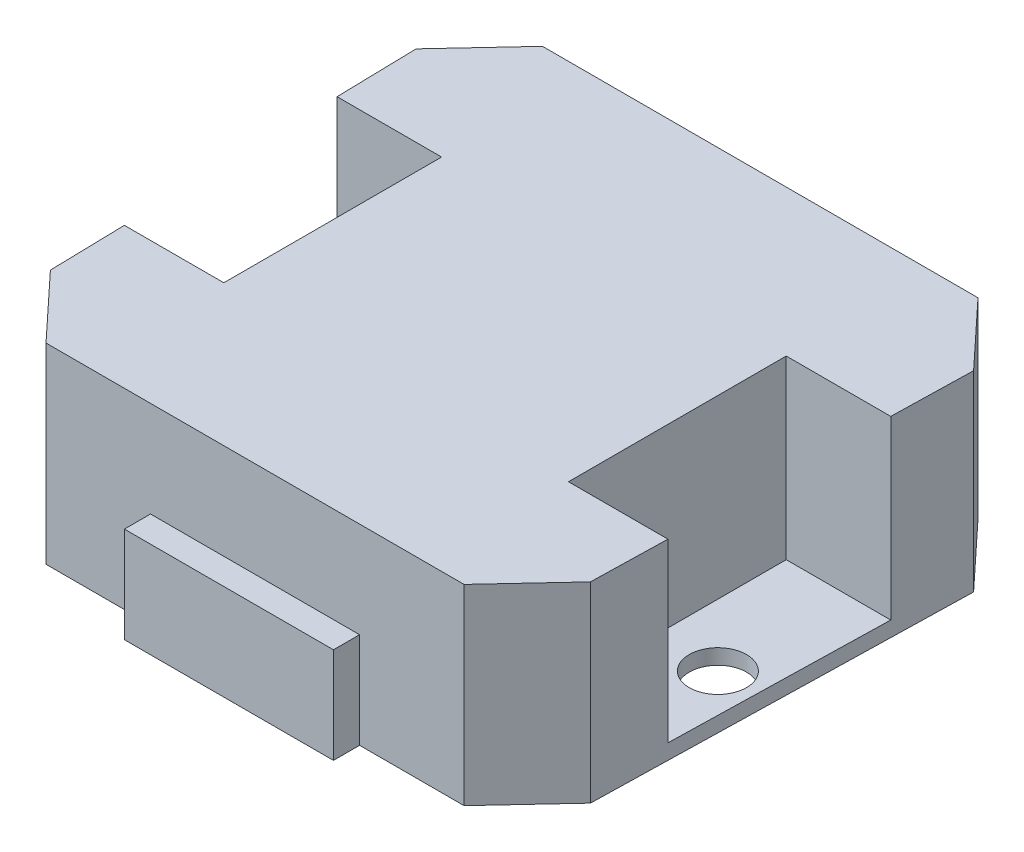
ISO-10303-21;
HEADER;
FILE_DESCRIPTION(('STEP AP214'),'2;1');
FILE_NAME('part.step','',(''),(''),'','','');
FILE_SCHEMA(('AUTOMOTIVE_DESIGN { 1 0 10303 214 1 1 1 1 }'));
ENDSEC;
DATA;
#1=APPLICATION_CONTEXT('core data for automotive mechanical design processes');
#2=APPLICATION_PROTOCOL_DEFINITION('international standard','automotive_design',2000,#1);
#3=PRODUCT_CONTEXT('',#1,'mechanical');
#4=PRODUCT('Part','Part','',(#3));
#5=PRODUCT_RELATED_PRODUCT_CATEGORY('part','',(#4));
#6=PRODUCT_DEFINITION_FORMATION('','',#4);
#7=PRODUCT_DEFINITION_CONTEXT('part definition',#1,'design');
#8=PRODUCT_DEFINITION('design','',#6,#7);
#9=PRODUCT_DEFINITION_SHAPE('','',#8);
#10=(LENGTH_UNIT() NAMED_UNIT(*) SI_UNIT(.MILLI.,.METRE.));
#11=(NAMED_UNIT(*) PLANE_ANGLE_UNIT() SI_UNIT($,.RADIAN.));
#12=(NAMED_UNIT(*) SI_UNIT($,.STERADIAN.) SOLID_ANGLE_UNIT());
#13=UNCERTAINTY_MEASURE_WITH_UNIT(LENGTH_MEASURE(1.E-05),#10,'distance_accuracy_value','');
#14=(GEOMETRIC_REPRESENTATION_CONTEXT(3) GLOBAL_UNCERTAINTY_ASSIGNED_CONTEXT((#13)) GLOBAL_UNIT_ASSIGNED_CONTEXT((#10,
#11,#12)) REPRESENTATION_CONTEXT('',''));
#15=CARTESIAN_POINT('',(0.,0.,0.));
#16=DIRECTION('',(0.,0.,1.));
#17=DIRECTION('',(1.,0.,0.));
#18=AXIS2_PLACEMENT_3D('',#15,#16,#17);
#19=CARTESIAN_POINT('',(24.,22.,29.));
#20=DIRECTION('',(0.,0.,-1.));
#21=DIRECTION('',(-1.,0.,0.));
#22=AXIS2_PLACEMENT_3D('',#19,#20,#21);
#23=PLANE('',#22);
#24=DIRECTION('',(0.,-1.,0.));
#25=VECTOR('',#24,1.);
#26=CARTESIAN_POINT('',(-12.,0.,29.));
#27=LINE('',#26,#25);
#28=CARTESIAN_POINT('',(-12.,11.,29.));
#29=VERTEX_POINT('',#28);
#30=CARTESIAN_POINT('',(-12.,0.,29.));
#31=VERTEX_POINT('',#30);
#32=EDGE_CURVE('E233',#29,#31,#27,.T.);
#33=ORIENTED_EDGE('',*,*,#32,.F.);
#34=DIRECTION('',(-1.,0.,0.));
#35=VECTOR('',#34,1.);
#36=CARTESIAN_POINT('',(-12.,11.,29.));
#37=LINE('',#36,#35);
#38=CARTESIAN_POINT('',(12.,11.,29.));
#39=VERTEX_POINT('',#38);
#40=EDGE_CURVE('E238',#39,#29,#37,.T.);
#41=ORIENTED_EDGE('',*,*,#40,.F.);
#42=DIRECTION('',(0.,1.,0.));
#43=VECTOR('',#42,1.);
#44=CARTESIAN_POINT('',(12.,0.,29.));
#45=LINE('',#44,#43);
#46=CARTESIAN_POINT('',(12.,0.,29.));
#47=VERTEX_POINT('',#46);
#48=EDGE_CURVE('E247',#47,#39,#45,.T.);
#49=ORIENTED_EDGE('',*,*,#48,.F.);
#50=DIRECTION('',(1.,0.,0.));
#51=VECTOR('',#50,1.);
#52=CARTESIAN_POINT('',(24.,0.,29.));
#53=LINE('',#52,#51);
#54=CARTESIAN_POINT('',(24.,0.,29.));
#55=VERTEX_POINT('',#54);
#56=EDGE_CURVE('E306',#47,#55,#53,.T.);
#57=ORIENTED_EDGE('',*,*,#56,.T.);
#58=DIRECTION('',(0.,-1.,0.));
#59=VECTOR('',#58,1.);
#60=CARTESIAN_POINT('',(24.,22.,29.));
#61=LINE('',#60,#59);
#62=CARTESIAN_POINT('',(24.,22.,29.));
#63=VERTEX_POINT('',#62);
#64=EDGE_CURVE('E291',#63,#55,#61,.T.);
#65=ORIENTED_EDGE('',*,*,#64,.F.);
#66=DIRECTION('',(1.,0.,0.));
#67=VECTOR('',#66,1.);
#68=CARTESIAN_POINT('',(24.,22.,29.));
#69=LINE('',#68,#67);
#70=CARTESIAN_POINT('',(-24.,22.,29.));
#71=VERTEX_POINT('',#70);
#72=EDGE_CURVE('E289',#71,#63,#69,.T.);
#73=ORIENTED_EDGE('',*,*,#72,.F.);
#74=DIRECTION('',(0.,-1.,0.));
#75=VECTOR('',#74,1.);
#76=CARTESIAN_POINT('',(-24.,22.,29.));
#77=LINE('',#76,#75);
#78=CARTESIAN_POINT('',(-24.,0.,29.));
#79=VERTEX_POINT('',#78);
#80=EDGE_CURVE('E310',#71,#79,#77,.T.);
#81=ORIENTED_EDGE('',*,*,#80,.T.);
#82=EDGE_CURVE('E274',#79,#31,#53,.T.);
#83=ORIENTED_EDGE('',*,*,#82,.T.);
#84=EDGE_LOOP('',(#33,#41,#49,#57,#65,#73,#81,#83));
#85=FACE_BOUND('',#84,.T.);
#86=ADVANCED_FACE('F34',(#85),#23,.F.);
#87=CARTESIAN_POINT('',(0.,22.,0.));
#88=DIRECTION('',(0.,-1.,0.));
#89=DIRECTION('',(0.,0.,-1.));
#90=AXIS2_PLACEMENT_3D('',#87,#88,#89);
#91=PLANE('',#90);
#92=DIRECTION('',(0.0232558139534884,0.,-0.999729546986264));
#93=VECTOR('',#92,1.);
#94=CARTESIAN_POINT('',(32.,22.,-21.4941852602047));
#95=LINE('',#94,#93);
#96=CARTESIAN_POINT('',(31.,22.,21.4941852602046));
#97=VERTEX_POINT('',#96);
#98=CARTESIAN_POINT('',(31.2022450526725,22.,12.8));
#99=VERTEX_POINT('',#98);
#100=EDGE_CURVE('E275',#97,#99,#95,.T.);
#101=ORIENTED_EDGE('',*,*,#100,.T.);
#102=DIRECTION('',(1.,0.,0.));
#103=VECTOR('',#102,1.);
#104=CARTESIAN_POINT('',(19.7837976841715,22.,12.8000000000003));
#105=LINE('',#104,#103);
#106=CARTESIAN_POINT('',(19.7837976841715,22.,12.8000000000003));
#107=VERTEX_POINT('',#106);
#108=EDGE_CURVE('E189',#107,#99,#105,.T.);
#109=ORIENTED_EDGE('',*,*,#108,.F.);
#110=DIRECTION('',(0.,0.,1.));
#111=VECTOR('',#110,1.);
#112=CARTESIAN_POINT('',(19.7837976841715,22.,-12.2));
#113=LINE('',#112,#111);
#114=CARTESIAN_POINT('',(19.7837976841715,22.,-12.2));
#115=VERTEX_POINT('',#114);
#116=EDGE_CURVE('E176',#115,#107,#113,.T.);
#117=ORIENTED_EDGE('',*,*,#116,.F.);
#118=DIRECTION('',(-1.,0.,0.));
#119=VECTOR('',#118,1.);
#120=CARTESIAN_POINT('',(19.7837976841715,22.,-12.2));
#121=LINE('',#120,#119);
#122=CARTESIAN_POINT('',(31.7837976841715,22.,-12.2));
#123=VERTEX_POINT('',#122);
#124=EDGE_CURVE('E182',#123,#115,#121,.T.);
#125=ORIENTED_EDGE('',*,*,#124,.F.);
#126=CARTESIAN_POINT('',(32.,22.,-21.4941852602047));
#127=VERTEX_POINT('',#126);
#128=EDGE_CURVE('E273',#123,#127,#95,.T.);
#129=ORIENTED_EDGE('',*,*,#128,.T.);
#130=DIRECTION('',(-0.682035596562351,0.,-0.731318976248968));
#131=VECTOR('',#130,1.);
#132=CARTESIAN_POINT('',(25.,22.,-29.));
#133=LINE('',#132,#131);
#134=CARTESIAN_POINT('',(25.,22.,-29.));
#135=VERTEX_POINT('',#134);
#136=EDGE_CURVE('E277',#127,#135,#133,.T.);
#137=ORIENTED_EDGE('',*,*,#136,.T.);
#138=DIRECTION('',(-1.,0.,0.));
#139=VECTOR('',#138,1.);
#140=CARTESIAN_POINT('',(-25.,22.,-29.));
#141=LINE('',#140,#139);
#142=CARTESIAN_POINT('',(-25.,22.,-29.));
#143=VERTEX_POINT('',#142);
#144=EDGE_CURVE('E279',#135,#143,#141,.T.);
#145=ORIENTED_EDGE('',*,*,#144,.T.);
#146=DIRECTION('',(-0.682035596562351,0.,0.731318976248968));
#147=VECTOR('',#146,1.);
#148=CARTESIAN_POINT('',(-32.,22.,-21.4941852602047));
#149=LINE('',#148,#147);
#150=CARTESIAN_POINT('',(-32.,22.,-21.4941852602047));
#151=VERTEX_POINT('',#150);
#152=EDGE_CURVE('E281',#143,#151,#149,.T.);
#153=ORIENTED_EDGE('',*,*,#152,.T.);
#154=DIRECTION('',(0.0232558139534884,0.,0.999729546986264));
#155=VECTOR('',#154,1.);
#156=CARTESIAN_POINT('',(-31.,22.,21.4941852602046));
#157=LINE('',#156,#155);
#158=CARTESIAN_POINT('',(-31.7837976841715,22.,-12.2));
#159=VERTEX_POINT('',#158);
#160=EDGE_CURVE('E284',#151,#159,#157,.T.);
#161=ORIENTED_EDGE('',*,*,#160,.T.);
#162=DIRECTION('',(-1.,0.,0.));
#163=VECTOR('',#162,1.);
#164=CARTESIAN_POINT('',(-19.7837976841715,22.,-12.2));
#165=LINE('',#164,#163);
#166=CARTESIAN_POINT('',(-19.7837976841715,22.,-12.2));
#167=VERTEX_POINT('',#166);
#168=EDGE_CURVE('E211',#167,#159,#165,.T.);
#169=ORIENTED_EDGE('',*,*,#168,.F.);
#170=DIRECTION('',(0.,0.,-1.));
#171=VECTOR('',#170,1.);
#172=CARTESIAN_POINT('',(-19.7837976841715,22.,-12.2));
#173=LINE('',#172,#171);
#174=CARTESIAN_POINT('',(-19.7837976841715,22.,12.8));
#175=VERTEX_POINT('',#174);
#176=EDGE_CURVE('E207',#175,#167,#173,.T.);
#177=ORIENTED_EDGE('',*,*,#176,.F.);
#178=DIRECTION('',(1.,0.,0.));
#179=VECTOR('',#178,1.);
#180=CARTESIAN_POINT('',(-19.7837976841715,22.,12.8));
#181=LINE('',#180,#179);
#182=CARTESIAN_POINT('',(-31.2022450526725,22.,12.8));
#183=VERTEX_POINT('',#182);
#184=EDGE_CURVE('E208',#183,#175,#181,.T.);
#185=ORIENTED_EDGE('',*,*,#184,.F.);
#186=CARTESIAN_POINT('',(-31.,22.,21.4941852602046));
#187=VERTEX_POINT('',#186);
#188=EDGE_CURVE('E283',#183,#187,#157,.T.);
#189=ORIENTED_EDGE('',*,*,#188,.T.);
#190=DIRECTION('',(0.682035596562348,0.,0.73131897624897));
#191=VECTOR('',#190,1.);
#192=CARTESIAN_POINT('',(-24.,22.,29.));
#193=LINE('',#192,#191);
#194=EDGE_CURVE('E287',#187,#71,#193,.T.);
#195=ORIENTED_EDGE('',*,*,#194,.T.);
#196=ORIENTED_EDGE('',*,*,#72,.T.);
#197=DIRECTION('',(0.682035596562348,0.,-0.73131897624897));
#198=VECTOR('',#197,1.);
#199=CARTESIAN_POINT('',(31.,22.,21.4941852602046));
#200=LINE('',#199,#198);
#201=EDGE_CURVE('E270',#63,#97,#200,.T.);
#202=ORIENTED_EDGE('',*,*,#201,.T.);
#203=EDGE_LOOP('',(#101,#109,#117,#125,#129,#137,#145,#153,#161,#169,#177,#185,#189,#195,#196,#202));
#204=FACE_BOUND('',#203,.T.);
#205=ADVANCED_FACE('F192',(#204),#91,.F.);
#206=CARTESIAN_POINT('',(0.,0.,0.));
#207=DIRECTION('',(0.,-1.,0.));
#208=DIRECTION('',(0.,0.,-1.));
#209=AXIS2_PLACEMENT_3D('',#206,#207,#208);
#210=PLANE('',#209);
#211=CARTESIAN_POINT('',(-26.9336487374695,0.,2.8));
#212=DIRECTION('',(0.,1.,0.));
#213=DIRECTION('',(0.,0.,1.));
#214=AXIS2_PLACEMENT_3D('',#211,#212,#213);
#215=CIRCLE('',#214,3.29);
#216=CARTESIAN_POINT('',(-26.9336487374695,0.,6.09000000000001));
#217=VERTEX_POINT('',#216);
#218=EDGE_CURVE('E266',#217,#217,#215,.T.);
#219=ORIENTED_EDGE('',*,*,#218,.T.);
#220=EDGE_LOOP('',(#219));
#221=FACE_BOUND('',#220,.T.);
#222=DIRECTION('',(0.682035596562348,0.,-0.73131897624897));
#223=VECTOR('',#222,1.);
#224=CARTESIAN_POINT('',(31.,0.,21.4941852602046));
#225=LINE('',#224,#223);
#226=CARTESIAN_POINT('',(31.,0.,21.4941852602046));
#227=VERTEX_POINT('',#226);
#228=EDGE_CURVE('E269',#55,#227,#225,.T.);
#229=ORIENTED_EDGE('',*,*,#228,.F.);
#230=ORIENTED_EDGE('',*,*,#56,.F.);
#231=DIRECTION('',(0.,0.,-1.));
#232=VECTOR('',#231,1.);
#233=CARTESIAN_POINT('',(12.,0.,32.));
#234=LINE('',#233,#232);
#235=CARTESIAN_POINT('',(12.,0.,32.));
#236=VERTEX_POINT('',#235);
#237=EDGE_CURVE('E257',#236,#47,#234,.T.);
#238=ORIENTED_EDGE('',*,*,#237,.F.);
#239=DIRECTION('',(1.,0.,0.));
#240=VECTOR('',#239,1.);
#241=CARTESIAN_POINT('',(-12.,0.,32.));
#242=LINE('',#241,#240);
#243=CARTESIAN_POINT('',(-12.,0.,32.));
#244=VERTEX_POINT('',#243);
#245=EDGE_CURVE('E237',#244,#236,#242,.T.);
#246=ORIENTED_EDGE('',*,*,#245,.F.);
#247=DIRECTION('',(0.,0.,-1.));
#248=VECTOR('',#247,1.);
#249=CARTESIAN_POINT('',(-12.,0.,32.));
#250=LINE('',#249,#248);
#251=EDGE_CURVE('E260',#244,#31,#250,.T.);
#252=ORIENTED_EDGE('',*,*,#251,.T.);
#253=ORIENTED_EDGE('',*,*,#82,.F.);
#254=DIRECTION('',(0.682035596562348,0.,0.73131897624897));
#255=VECTOR('',#254,1.);
#256=CARTESIAN_POINT('',(-24.,0.,29.));
#257=LINE('',#256,#255);
#258=CARTESIAN_POINT('',(-31.,0.,21.4941852602046));
#259=VERTEX_POINT('',#258);
#260=EDGE_CURVE('E304',#259,#79,#257,.T.);
#261=ORIENTED_EDGE('',*,*,#260,.F.);
#262=DIRECTION('',(0.0232558139534884,0.,0.999729546986264));
#263=VECTOR('',#262,1.);
#264=CARTESIAN_POINT('',(-31.,0.,21.4941852602046));
#265=LINE('',#264,#263);
#266=CARTESIAN_POINT('',(-32.,0.,-21.4941852602047));
#267=VERTEX_POINT('',#266);
#268=EDGE_CURVE('E302',#267,#259,#265,.T.);
#269=ORIENTED_EDGE('',*,*,#268,.F.);
#270=DIRECTION('',(-0.682035596562351,0.,0.731318976248968));
#271=VECTOR('',#270,1.);
#272=CARTESIAN_POINT('',(-32.,0.,-21.4941852602047));
#273=LINE('',#272,#271);
#274=CARTESIAN_POINT('',(-25.,0.,-29.));
#275=VERTEX_POINT('',#274);
#276=EDGE_CURVE('E300',#275,#267,#273,.T.);
#277=ORIENTED_EDGE('',*,*,#276,.F.);
#278=DIRECTION('',(-1.,0.,0.));
#279=VECTOR('',#278,1.);
#280=CARTESIAN_POINT('',(-25.,0.,-29.));
#281=LINE('',#280,#279);
#282=CARTESIAN_POINT('',(25.,0.,-29.));
#283=VERTEX_POINT('',#282);
#284=EDGE_CURVE('E298',#283,#275,#281,.T.);
#285=ORIENTED_EDGE('',*,*,#284,.F.);
#286=DIRECTION('',(-0.682035596562351,0.,-0.731318976248968));
#287=VECTOR('',#286,1.);
#288=CARTESIAN_POINT('',(25.,0.,-29.));
#289=LINE('',#288,#287);
#290=CARTESIAN_POINT('',(32.,0.,-21.4941852602047));
#291=VERTEX_POINT('',#290);
#292=EDGE_CURVE('E296',#291,#283,#289,.T.);
#293=ORIENTED_EDGE('',*,*,#292,.F.);
#294=DIRECTION('',(0.0232558139534884,0.,-0.999729546986264));
#295=VECTOR('',#294,1.);
#296=CARTESIAN_POINT('',(32.,0.,-21.4941852602047));
#297=LINE('',#296,#295);
#298=EDGE_CURVE('E294',#227,#291,#297,.T.);
#299=ORIENTED_EDGE('',*,*,#298,.F.);
#300=EDGE_LOOP('',(#229,#230,#238,#246,#252,#253,#261,#269,#277,#285,#293,#299));
#301=FACE_BOUND('',#300,.T.);
#302=CARTESIAN_POINT('',(26.9336487374695,0.,2.8));
#303=DIRECTION('',(0.,1.,0.));
#304=DIRECTION('',(0.,0.,1.));
#305=AXIS2_PLACEMENT_3D('',#302,#303,#304);
#306=CIRCLE('',#305,3.29);
#307=CARTESIAN_POINT('',(26.9336487374695,0.,6.09));
#308=VERTEX_POINT('',#307);
#309=EDGE_CURVE('E263',#308,#308,#306,.T.);
#310=ORIENTED_EDGE('',*,*,#309,.T.);
#311=EDGE_LOOP('',(#310));
#312=FACE_BOUND('',#311,.T.);
#313=ADVANCED_FACE('F348',(#221,#301,#312),#210,.T.);
#314=CARTESIAN_POINT('',(31.,22.,21.4941852602046));
#315=DIRECTION('',(-0.73131897624897,0.,-0.682035596562348));
#316=DIRECTION('',(-0.682035596562348,0.,0.73131897624897));
#317=AXIS2_PLACEMENT_3D('',#314,#315,#316);
#318=PLANE('',#317);
#319=ORIENTED_EDGE('',*,*,#228,.T.);
#320=DIRECTION('',(0.,-1.,0.));
#321=VECTOR('',#320,1.);
#322=CARTESIAN_POINT('',(31.,22.,21.4941852602046));
#323=LINE('',#322,#321);
#324=EDGE_CURVE('E328',#97,#227,#323,.T.);
#325=ORIENTED_EDGE('',*,*,#324,.F.);
#326=ORIENTED_EDGE('',*,*,#201,.F.);
#327=ORIENTED_EDGE('',*,*,#64,.T.);
#328=EDGE_LOOP('',(#319,#325,#326,#327));
#329=FACE_BOUND('',#328,.T.);
#330=ADVANCED_FACE('F36',(#329),#318,.F.);
#331=CARTESIAN_POINT('',(32.,22.,-21.4941852602047));
#332=DIRECTION('',(-0.999729546986264,0.,-0.0232558139534884));
#333=DIRECTION('',(-0.0232558139534884,0.,0.999729546986264));
#334=AXIS2_PLACEMENT_3D('',#331,#332,#333);
#335=PLANE('',#334);
#336=DIRECTION('',(-0.0232558139534884,0.,0.999729546986264));
#337=VECTOR('',#336,1.);
#338=CARTESIAN_POINT('',(32.,1.75,-21.4941852602047));
#339=LINE('',#338,#337);
#340=CARTESIAN_POINT('',(31.7837976841715,1.74999999999999,-12.2));
#341=VERTEX_POINT('',#340);
#342=CARTESIAN_POINT('',(31.2022450526725,1.75,12.8));
#343=VERTEX_POINT('',#342);
#344=EDGE_CURVE('E204',#341,#343,#339,.T.);
#345=ORIENTED_EDGE('',*,*,#344,.T.);
#346=DIRECTION('',(0.,1.,0.));
#347=VECTOR('',#346,1.);
#348=CARTESIAN_POINT('',(31.2022450526725,22.,12.8));
#349=LINE('',#348,#347);
#350=EDGE_CURVE('E12',#343,#99,#349,.T.);
#351=ORIENTED_EDGE('',*,*,#350,.T.);
#352=ORIENTED_EDGE('',*,*,#100,.F.);
#353=ORIENTED_EDGE('',*,*,#324,.T.);
#354=ORIENTED_EDGE('',*,*,#298,.T.);
#355=DIRECTION('',(0.,-1.,0.));
#356=VECTOR('',#355,1.);
#357=CARTESIAN_POINT('',(32.,22.,-21.4941852602047));
#358=LINE('',#357,#356);
#359=EDGE_CURVE('E325',#127,#291,#358,.T.);
#360=ORIENTED_EDGE('',*,*,#359,.F.);
#361=ORIENTED_EDGE('',*,*,#128,.F.);
#362=DIRECTION('',(0.,1.,0.));
#363=VECTOR('',#362,1.);
#364=CARTESIAN_POINT('',(31.7837976841715,-27.7308492477243,-12.2));
#365=LINE('',#364,#363);
#366=EDGE_CURVE('E185',#341,#123,#365,.T.);
#367=ORIENTED_EDGE('',*,*,#366,.F.);
#368=EDGE_LOOP('',(#345,#351,#352,#353,#354,#360,#361,#367));
#369=FACE_BOUND('',#368,.T.);
#370=ADVANCED_FACE('F356',(#369),#335,.F.);
#371=CARTESIAN_POINT('',(25.,22.,-29.));
#372=DIRECTION('',(-0.731318976248968,0.,0.682035596562351));
#373=DIRECTION('',(0.682035596562351,0.,0.731318976248968));
#374=AXIS2_PLACEMENT_3D('',#371,#372,#373);
#375=PLANE('',#374);
#376=ORIENTED_EDGE('',*,*,#292,.T.);
#377=DIRECTION('',(0.,-1.,0.));
#378=VECTOR('',#377,1.);
#379=CARTESIAN_POINT('',(25.,22.,-29.));
#380=LINE('',#379,#378);
#381=EDGE_CURVE('E322',#135,#283,#380,.T.);
#382=ORIENTED_EDGE('',*,*,#381,.F.);
#383=ORIENTED_EDGE('',*,*,#136,.F.);
#384=ORIENTED_EDGE('',*,*,#359,.T.);
#385=EDGE_LOOP('',(#376,#382,#383,#384));
#386=FACE_BOUND('',#385,.T.);
#387=ADVANCED_FACE('F381',(#386),#375,.F.);
#388=CARTESIAN_POINT('',(-25.,22.,-29.));
#389=DIRECTION('',(0.,0.,1.));
#390=DIRECTION('',(1.,0.,0.));
#391=AXIS2_PLACEMENT_3D('',#388,#389,#390);
#392=PLANE('',#391);
#393=ORIENTED_EDGE('',*,*,#284,.T.);
#394=DIRECTION('',(0.,-1.,0.));
#395=VECTOR('',#394,1.);
#396=CARTESIAN_POINT('',(-25.,22.,-29.));
#397=LINE('',#396,#395);
#398=EDGE_CURVE('E319',#143,#275,#397,.T.);
#399=ORIENTED_EDGE('',*,*,#398,.F.);
#400=ORIENTED_EDGE('',*,*,#144,.F.);
#401=ORIENTED_EDGE('',*,*,#381,.T.);
#402=EDGE_LOOP('',(#393,#399,#400,#401));
#403=FACE_BOUND('',#402,.T.);
#404=ADVANCED_FACE('F377',(#403),#392,.F.);
#405=CARTESIAN_POINT('',(-32.,22.,-21.4941852602047));
#406=DIRECTION('',(0.731318976248968,0.,0.682035596562351));
#407=DIRECTION('',(0.682035596562351,0.,-0.731318976248968));
#408=AXIS2_PLACEMENT_3D('',#405,#406,#407);
#409=PLANE('',#408);
#410=ORIENTED_EDGE('',*,*,#276,.T.);
#411=DIRECTION('',(0.,-1.,0.));
#412=VECTOR('',#411,1.);
#413=CARTESIAN_POINT('',(-32.,22.,-21.4941852602047));
#414=LINE('',#413,#412);
#415=EDGE_CURVE('E316',#151,#267,#414,.T.);
#416=ORIENTED_EDGE('',*,*,#415,.F.);
#417=ORIENTED_EDGE('',*,*,#152,.F.);
#418=ORIENTED_EDGE('',*,*,#398,.T.);
#419=EDGE_LOOP('',(#410,#416,#417,#418));
#420=FACE_BOUND('',#419,.T.);
#421=ADVANCED_FACE('F373',(#420),#409,.F.);
#422=CARTESIAN_POINT('',(-31.,22.,21.4941852602046));
#423=DIRECTION('',(0.999729546986264,0.,-0.0232558139534884));
#424=DIRECTION('',(-0.0232558139534884,0.,-0.999729546986264));
#425=AXIS2_PLACEMENT_3D('',#422,#423,#424);
#426=PLANE('',#425);
#427=DIRECTION('',(-0.0232558139534884,0.,-0.999729546986264));
#428=VECTOR('',#427,1.);
#429=CARTESIAN_POINT('',(-31.,1.75,21.4941852602046));
#430=LINE('',#429,#428);
#431=CARTESIAN_POINT('',(-31.2022450526725,1.74999999999999,12.8));
#432=VERTEX_POINT('',#431);
#433=CARTESIAN_POINT('',(-31.7837976841715,1.74999999999999,-12.2));
#434=VERTEX_POINT('',#433);
#435=EDGE_CURVE('E230',#432,#434,#430,.T.);
#436=ORIENTED_EDGE('',*,*,#435,.T.);
#437=DIRECTION('',(0.,1.,0.));
#438=VECTOR('',#437,1.);
#439=CARTESIAN_POINT('',(-31.7837976841715,-27.7308492477243,-12.2));
#440=LINE('',#439,#438);
#441=EDGE_CURVE('E217',#434,#159,#440,.T.);
#442=ORIENTED_EDGE('',*,*,#441,.T.);
#443=ORIENTED_EDGE('',*,*,#160,.F.);
#444=ORIENTED_EDGE('',*,*,#415,.T.);
#445=ORIENTED_EDGE('',*,*,#268,.T.);
#446=DIRECTION('',(0.,-1.,0.));
#447=VECTOR('',#446,1.);
#448=CARTESIAN_POINT('',(-31.,22.,21.4941852602046));
#449=LINE('',#448,#447);
#450=EDGE_CURVE('E313',#187,#259,#449,.T.);
#451=ORIENTED_EDGE('',*,*,#450,.F.);
#452=ORIENTED_EDGE('',*,*,#188,.F.);
#453=DIRECTION('',(0.,-1.,0.));
#454=VECTOR('',#453,1.);
#455=CARTESIAN_POINT('',(-31.2022450526725,22.,12.8));
#456=LINE('',#455,#454);
#457=EDGE_CURVE('E42',#183,#432,#456,.T.);
#458=ORIENTED_EDGE('',*,*,#457,.T.);
#459=EDGE_LOOP('',(#436,#442,#443,#444,#445,#451,#452,#458));
#460=FACE_BOUND('',#459,.T.);
#461=ADVANCED_FACE('F369',(#460),#426,.F.);
#462=CARTESIAN_POINT('',(-24.,22.,29.));
#463=DIRECTION('',(0.73131897624897,0.,-0.682035596562348));
#464=DIRECTION('',(-0.682035596562348,0.,-0.73131897624897));
#465=AXIS2_PLACEMENT_3D('',#462,#463,#464);
#466=PLANE('',#465);
#467=ORIENTED_EDGE('',*,*,#260,.T.);
#468=ORIENTED_EDGE('',*,*,#80,.F.);
#469=ORIENTED_EDGE('',*,*,#194,.F.);
#470=ORIENTED_EDGE('',*,*,#450,.T.);
#471=EDGE_LOOP('',(#467,#468,#469,#470));
#472=FACE_BOUND('',#471,.T.);
#473=ADVANCED_FACE('F366',(#472),#466,.F.);
#474=CARTESIAN_POINT('',(-26.9336487374695,22.,2.8));
#475=DIRECTION('',(0.,-1.,0.));
#476=DIRECTION('',(0.,0.,-1.));
#477=AXIS2_PLACEMENT_3D('',#474,#475,#476);
#478=CYLINDRICAL_SURFACE('',#477,3.29);
#479=CARTESIAN_POINT('',(-26.9336487374695,1.75,2.8));
#480=DIRECTION('',(0.,-1.,0.));
#481=DIRECTION('',(0.,0.,-1.));
#482=AXIS2_PLACEMENT_3D('',#479,#480,#481);
#483=CIRCLE('',#482,3.29);
#484=CARTESIAN_POINT('',(-26.9336487374695,1.75,-0.489999999999997));
#485=VERTEX_POINT('',#484);
#486=EDGE_CURVE('E229',#485,#485,#483,.T.);
#487=ORIENTED_EDGE('',*,*,#486,.F.);
#488=EDGE_LOOP('',(#487));
#489=FACE_BOUND('',#488,.T.);
#490=ORIENTED_EDGE('',*,*,#218,.F.);
#491=EDGE_LOOP('',(#490));
#492=FACE_BOUND('',#491,.T.);
#493=ADVANCED_FACE('F344',(#489,#492),#478,.F.);
#494=CARTESIAN_POINT('',(26.9336487374695,22.,2.8));
#495=DIRECTION('',(0.,-1.,0.));
#496=DIRECTION('',(0.,0.,-1.));
#497=AXIS2_PLACEMENT_3D('',#494,#495,#496);
#498=CYLINDRICAL_SURFACE('',#497,3.29);
#499=CARTESIAN_POINT('',(26.9336487374695,1.75,2.8));
#500=DIRECTION('',(0.,-1.,0.));
#501=DIRECTION('',(0.,0.,-1.));
#502=AXIS2_PLACEMENT_3D('',#499,#500,#501);
#503=CIRCLE('',#502,3.29);
#504=CARTESIAN_POINT('',(26.9336487374695,1.75,-0.490000000000001));
#505=VERTEX_POINT('',#504);
#506=EDGE_CURVE('E203',#505,#505,#503,.T.);
#507=ORIENTED_EDGE('',*,*,#506,.F.);
#508=EDGE_LOOP('',(#507));
#509=FACE_BOUND('',#508,.T.);
#510=ORIENTED_EDGE('',*,*,#309,.F.);
#511=EDGE_LOOP('',(#510));
#512=FACE_BOUND('',#511,.T.);
#513=ADVANCED_FACE('F340',(#509,#512),#498,.F.);
#514=CARTESIAN_POINT('',(-12.,0.,32.));
#515=DIRECTION('',(1.,0.,0.));
#516=DIRECTION('',(0.,0.,-1.));
#517=AXIS2_PLACEMENT_3D('',#514,#515,#516);
#518=PLANE('',#517);
#519=ORIENTED_EDGE('',*,*,#32,.T.);
#520=ORIENTED_EDGE('',*,*,#251,.F.);
#521=DIRECTION('',(0.,-1.,0.));
#522=VECTOR('',#521,1.);
#523=CARTESIAN_POINT('',(-12.,0.,32.));
#524=LINE('',#523,#522);
#525=CARTESIAN_POINT('',(-12.,11.,32.));
#526=VERTEX_POINT('',#525);
#527=EDGE_CURVE('E234',#526,#244,#524,.T.);
#528=ORIENTED_EDGE('',*,*,#527,.F.);
#529=DIRECTION('',(0.,0.,-1.));
#530=VECTOR('',#529,1.);
#531=CARTESIAN_POINT('',(-12.,11.,32.));
#532=LINE('',#531,#530);
#533=EDGE_CURVE('E244',#526,#29,#532,.T.);
#534=ORIENTED_EDGE('',*,*,#533,.T.);
#535=EDGE_LOOP('',(#519,#520,#528,#534));
#536=FACE_BOUND('',#535,.T.);
#537=ADVANCED_FACE('F343',(#536),#518,.F.);
#538=CARTESIAN_POINT('',(12.,0.,32.));
#539=DIRECTION('',(-1.,0.,0.));
#540=DIRECTION('',(0.,0.,1.));
#541=AXIS2_PLACEMENT_3D('',#538,#539,#540);
#542=PLANE('',#541);
#543=ORIENTED_EDGE('',*,*,#48,.T.);
#544=DIRECTION('',(0.,0.,-1.));
#545=VECTOR('',#544,1.);
#546=CARTESIAN_POINT('',(12.,11.,32.));
#547=LINE('',#546,#545);
#548=CARTESIAN_POINT('',(12.,11.,32.));
#549=VERTEX_POINT('',#548);
#550=EDGE_CURVE('E254',#549,#39,#547,.T.);
#551=ORIENTED_EDGE('',*,*,#550,.F.);
#552=DIRECTION('',(0.,1.,0.));
#553=VECTOR('',#552,1.);
#554=CARTESIAN_POINT('',(12.,0.,32.));
#555=LINE('',#554,#553);
#556=EDGE_CURVE('E240',#236,#549,#555,.T.);
#557=ORIENTED_EDGE('',*,*,#556,.F.);
#558=ORIENTED_EDGE('',*,*,#237,.T.);
#559=EDGE_LOOP('',(#543,#551,#557,#558));
#560=FACE_BOUND('',#559,.T.);
#561=ADVANCED_FACE('F422',(#560),#542,.F.);
#562=CARTESIAN_POINT('',(-12.,11.,32.));
#563=DIRECTION('',(0.,-1.,0.));
#564=DIRECTION('',(0.,0.,-1.));
#565=AXIS2_PLACEMENT_3D('',#562,#563,#564);
#566=PLANE('',#565);
#567=ORIENTED_EDGE('',*,*,#40,.T.);
#568=ORIENTED_EDGE('',*,*,#533,.F.);
#569=DIRECTION('',(-1.,0.,0.));
#570=VECTOR('',#569,1.);
#571=CARTESIAN_POINT('',(-12.,11.,32.));
#572=LINE('',#571,#570);
#573=EDGE_CURVE('E242',#549,#526,#572,.T.);
#574=ORIENTED_EDGE('',*,*,#573,.F.);
#575=ORIENTED_EDGE('',*,*,#550,.T.);
#576=EDGE_LOOP('',(#567,#568,#574,#575));
#577=FACE_BOUND('',#576,.T.);
#578=ADVANCED_FACE('F418',(#577),#566,.F.);
#579=CARTESIAN_POINT('',(0.,0.,32.));
#580=DIRECTION('',(0.,0.,-1.));
#581=DIRECTION('',(-1.,0.,0.));
#582=AXIS2_PLACEMENT_3D('',#579,#580,#581);
#583=PLANE('',#582);
#584=ORIENTED_EDGE('',*,*,#527,.T.);
#585=ORIENTED_EDGE('',*,*,#245,.T.);
#586=ORIENTED_EDGE('',*,*,#556,.T.);
#587=ORIENTED_EDGE('',*,*,#573,.T.);
#588=EDGE_LOOP('',(#584,#585,#586,#587));
#589=FACE_BOUND('',#588,.T.);
#590=ADVANCED_FACE('F409',(#589),#583,.F.);
#591=CARTESIAN_POINT('',(-19.7837976841715,-27.7308492477243,12.8));
#592=DIRECTION('',(0.,0.,1.));
#593=DIRECTION('',(1.,0.,0.));
#594=AXIS2_PLACEMENT_3D('',#591,#592,#593);
#595=PLANE('',#594);
#596=ORIENTED_EDGE('',*,*,#184,.T.);
#597=DIRECTION('',(0.,1.,0.));
#598=VECTOR('',#597,1.);
#599=CARTESIAN_POINT('',(-19.7837976841715,-27.7308492477243,12.8));
#600=LINE('',#599,#598);
#601=CARTESIAN_POINT('',(-19.7837976841715,1.75,12.8));
#602=VERTEX_POINT('',#601);
#603=EDGE_CURVE('E222',#602,#175,#600,.T.);
#604=ORIENTED_EDGE('',*,*,#603,.F.);
#605=DIRECTION('',(1.,0.,0.));
#606=VECTOR('',#605,1.);
#607=CARTESIAN_POINT('',(-19.7837976841715,1.75,12.8));
#608=LINE('',#607,#606);
#609=EDGE_CURVE('E57',#432,#602,#608,.T.);
#610=ORIENTED_EDGE('',*,*,#609,.F.);
#611=ORIENTED_EDGE('',*,*,#457,.F.);
#612=EDGE_LOOP('',(#596,#604,#610,#611));
#613=FACE_BOUND('',#612,.T.);
#614=ADVANCED_FACE('F405',(#613),#595,.F.);
#615=CARTESIAN_POINT('',(0.,1.75,0.));
#616=DIRECTION('',(0.,-1.,0.));
#617=DIRECTION('',(0.,0.,-1.));
#618=AXIS2_PLACEMENT_3D('',#615,#616,#617);
#619=PLANE('',#618);
#620=ORIENTED_EDGE('',*,*,#486,.T.);
#621=EDGE_LOOP('',(#620));
#622=FACE_BOUND('',#621,.T.);
#623=ORIENTED_EDGE('',*,*,#609,.T.);
#624=DIRECTION('',(0.,0.,-1.));
#625=VECTOR('',#624,1.);
#626=CARTESIAN_POINT('',(-19.7837976841715,1.75,-12.2));
#627=LINE('',#626,#625);
#628=CARTESIAN_POINT('',(-19.7837976841715,1.75,-12.2));
#629=VERTEX_POINT('',#628);
#630=EDGE_CURVE('E218',#602,#629,#627,.T.);
#631=ORIENTED_EDGE('',*,*,#630,.T.);
#632=DIRECTION('',(-1.,0.,0.));
#633=VECTOR('',#632,1.);
#634=CARTESIAN_POINT('',(-19.7837976841715,1.75,-12.2));
#635=LINE('',#634,#633);
#636=EDGE_CURVE('E210',#629,#434,#635,.T.);
#637=ORIENTED_EDGE('',*,*,#636,.T.);
#638=ORIENTED_EDGE('',*,*,#435,.F.);
#639=EDGE_LOOP('',(#623,#631,#637,#638));
#640=FACE_BOUND('',#639,.T.);
#641=ADVANCED_FACE('F408',(#622,#640),#619,.F.);
#642=CARTESIAN_POINT('',(-19.7837976841715,-27.7308492477243,-12.2));
#643=DIRECTION('',(0.,0.,-1.));
#644=DIRECTION('',(-1.,0.,0.));
#645=AXIS2_PLACEMENT_3D('',#642,#643,#644);
#646=PLANE('',#645);
#647=DIRECTION('',(0.,1.,0.));
#648=VECTOR('',#647,1.);
#649=CARTESIAN_POINT('',(-19.7837976841715,-27.7308492477243,-12.2));
#650=LINE('',#649,#648);
#651=EDGE_CURVE('E221',#629,#167,#650,.T.);
#652=ORIENTED_EDGE('',*,*,#651,.T.);
#653=ORIENTED_EDGE('',*,*,#168,.T.);
#654=ORIENTED_EDGE('',*,*,#441,.F.);
#655=ORIENTED_EDGE('',*,*,#636,.F.);
#656=EDGE_LOOP('',(#652,#653,#654,#655));
#657=FACE_BOUND('',#656,.T.);
#658=ADVANCED_FACE('F399',(#657),#646,.F.);
#659=CARTESIAN_POINT('',(-19.7837976841715,-27.7308492477243,-12.2));
#660=DIRECTION('',(1.,0.,0.));
#661=DIRECTION('',(0.,0.,-1.));
#662=AXIS2_PLACEMENT_3D('',#659,#660,#661);
#663=PLANE('',#662);
#664=ORIENTED_EDGE('',*,*,#603,.T.);
#665=ORIENTED_EDGE('',*,*,#176,.T.);
#666=ORIENTED_EDGE('',*,*,#651,.F.);
#667=ORIENTED_EDGE('',*,*,#630,.F.);
#668=EDGE_LOOP('',(#664,#665,#666,#667));
#669=FACE_BOUND('',#668,.T.);
#670=ADVANCED_FACE('F392',(#669),#663,.F.);
#671=CARTESIAN_POINT('',(19.7837976841715,-27.7308492477243,12.8000000000003));
#672=DIRECTION('',(0.,0.,1.));
#673=DIRECTION('',(1.,0.,0.));
#674=AXIS2_PLACEMENT_3D('',#671,#672,#673);
#675=PLANE('',#674);
#676=DIRECTION('',(1.,0.,0.));
#677=VECTOR('',#676,1.);
#678=CARTESIAN_POINT('',(19.7837976841715,1.75,12.8000000000003));
#679=LINE('',#678,#677);
#680=CARTESIAN_POINT('',(19.7837976841715,1.75,12.8000000000003));
#681=VERTEX_POINT('',#680);
#682=EDGE_CURVE('E188',#681,#343,#679,.T.);
#683=ORIENTED_EDGE('',*,*,#682,.F.);
#684=DIRECTION('',(0.,1.,0.));
#685=VECTOR('',#684,1.);
#686=CARTESIAN_POINT('',(19.7837976841715,-27.7308492477243,12.8000000000003));
#687=LINE('',#686,#685);
#688=EDGE_CURVE('E199',#681,#107,#687,.T.);
#689=ORIENTED_EDGE('',*,*,#688,.T.);
#690=ORIENTED_EDGE('',*,*,#108,.T.);
#691=ORIENTED_EDGE('',*,*,#350,.F.);
#692=EDGE_LOOP('',(#683,#689,#690,#691));
#693=FACE_BOUND('',#692,.T.);
#694=ADVANCED_FACE('F390',(#693),#675,.F.);
#695=CARTESIAN_POINT('',(0.,1.75,0.));
#696=DIRECTION('',(0.,-1.,0.));
#697=DIRECTION('',(0.,0.,-1.));
#698=AXIS2_PLACEMENT_3D('',#695,#696,#697);
#699=PLANE('',#698);
#700=ORIENTED_EDGE('',*,*,#506,.T.);
#701=EDGE_LOOP('',(#700));
#702=FACE_BOUND('',#701,.T.);
#703=DIRECTION('',(-1.,0.,0.));
#704=VECTOR('',#703,1.);
#705=CARTESIAN_POINT('',(19.7837976841715,1.75,-12.2));
#706=LINE('',#705,#704);
#707=CARTESIAN_POINT('',(19.7837976841715,1.75,-12.2));
#708=VERTEX_POINT('',#707);
#709=EDGE_CURVE('E49',#341,#708,#706,.T.);
#710=ORIENTED_EDGE('',*,*,#709,.T.);
#711=DIRECTION('',(0.,0.,1.));
#712=VECTOR('',#711,1.);
#713=CARTESIAN_POINT('',(19.7837976841715,1.75,-12.2));
#714=LINE('',#713,#712);
#715=EDGE_CURVE('E179',#708,#681,#714,.T.);
#716=ORIENTED_EDGE('',*,*,#715,.T.);
#717=ORIENTED_EDGE('',*,*,#682,.T.);
#718=ORIENTED_EDGE('',*,*,#344,.F.);
#719=EDGE_LOOP('',(#710,#716,#717,#718));
#720=FACE_BOUND('',#719,.T.);
#721=ADVANCED_FACE('F337',(#702,#720),#699,.F.);
#722=CARTESIAN_POINT('',(19.7837976841715,-27.7308492477243,-12.2));
#723=DIRECTION('',(0.,0.,-1.));
#724=DIRECTION('',(-1.,0.,0.));
#725=AXIS2_PLACEMENT_3D('',#722,#723,#724);
#726=PLANE('',#725);
#727=ORIENTED_EDGE('',*,*,#366,.T.);
#728=ORIENTED_EDGE('',*,*,#124,.T.);
#729=DIRECTION('',(0.,1.,0.));
#730=VECTOR('',#729,1.);
#731=CARTESIAN_POINT('',(19.7837976841715,-27.7308492477243,-12.2));
#732=LINE('',#731,#730);
#733=EDGE_CURVE('E171',#708,#115,#732,.T.);
#734=ORIENTED_EDGE('',*,*,#733,.F.);
#735=ORIENTED_EDGE('',*,*,#709,.F.);
#736=EDGE_LOOP('',(#727,#728,#734,#735));
#737=FACE_BOUND('',#736,.T.);
#738=ADVANCED_FACE('F183',(#737),#726,.F.);
#739=CARTESIAN_POINT('',(19.7837976841715,-27.7308492477243,-12.2));
#740=DIRECTION('',(-1.,0.,0.));
#741=DIRECTION('',(0.,0.,1.));
#742=AXIS2_PLACEMENT_3D('',#739,#740,#741);
#743=PLANE('',#742);
#744=ORIENTED_EDGE('',*,*,#733,.T.);
#745=ORIENTED_EDGE('',*,*,#116,.T.);
#746=ORIENTED_EDGE('',*,*,#688,.F.);
#747=ORIENTED_EDGE('',*,*,#715,.F.);
#748=EDGE_LOOP('',(#744,#745,#746,#747));
#749=FACE_BOUND('',#748,.T.);
#750=ADVANCED_FACE('F173',(#749),#743,.F.);
#751=CLOSED_SHELL('',(#86,#205,#313,#330,#370,#387,#404,#421,#461,#473,#493,#513,#537,#561,#578,
#590,#614,#641,#658,#670,#694,#721,#738,#750));
#752=MANIFOLD_SOLID_BREP('B2',#751);
#753=ADVANCED_BREP_SHAPE_REPRESENTATION('',(#18,#752),#14);
#754=SHAPE_DEFINITION_REPRESENTATION(#9,#753);
ENDSEC;
END-ISO-10303-21;
